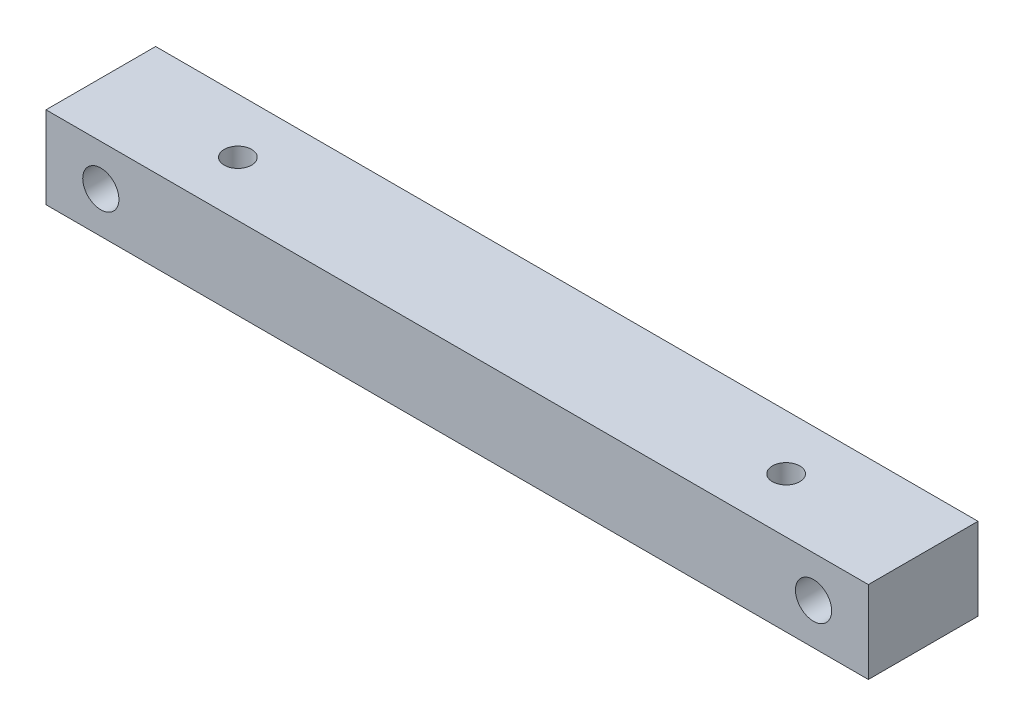
ISO-10303-21;
HEADER;
FILE_DESCRIPTION(('STEP AP214'),'2;1');
FILE_NAME('part.step','',(''),(''),'','','');
FILE_SCHEMA(('AUTOMOTIVE_DESIGN { 1 0 10303 214 1 1 1 1 }'));
ENDSEC;
DATA;
#1=APPLICATION_CONTEXT('core data for automotive mechanical design processes');
#2=APPLICATION_PROTOCOL_DEFINITION('international standard','automotive_design',2000,#1);
#3=PRODUCT_CONTEXT('',#1,'mechanical');
#4=PRODUCT('Part','Part','',(#3));
#5=PRODUCT_RELATED_PRODUCT_CATEGORY('part','',(#4));
#6=PRODUCT_DEFINITION_FORMATION('','',#4);
#7=PRODUCT_DEFINITION_CONTEXT('part definition',#1,'design');
#8=PRODUCT_DEFINITION('design','',#6,#7);
#9=PRODUCT_DEFINITION_SHAPE('','',#8);
#10=(LENGTH_UNIT() NAMED_UNIT(*) SI_UNIT(.MILLI.,.METRE.));
#11=(NAMED_UNIT(*) PLANE_ANGLE_UNIT() SI_UNIT($,.RADIAN.));
#12=(NAMED_UNIT(*) SI_UNIT($,.STERADIAN.) SOLID_ANGLE_UNIT());
#13=UNCERTAINTY_MEASURE_WITH_UNIT(LENGTH_MEASURE(1.E-05),#10,'distance_accuracy_value','');
#14=(GEOMETRIC_REPRESENTATION_CONTEXT(3) GLOBAL_UNCERTAINTY_ASSIGNED_CONTEXT((#13)) GLOBAL_UNIT_ASSIGNED_CONTEXT((#10,
#11,#12)) REPRESENTATION_CONTEXT('',''));
#15=CARTESIAN_POINT('',(0.,0.,0.));
#16=DIRECTION('',(0.,0.,1.));
#17=DIRECTION('',(1.,0.,0.));
#18=AXIS2_PLACEMENT_3D('',#15,#16,#17);
#19=CARTESIAN_POINT('',(-75.,7.49999999999999,20.));
#20=DIRECTION('',(1.,0.,0.));
#21=DIRECTION('',(0.,0.,-1.));
#22=AXIS2_PLACEMENT_3D('',#19,#20,#21);
#23=PLANE('',#22);
#24=DIRECTION('',(0.,-1.,0.));
#25=VECTOR('',#24,1.);
#26=CARTESIAN_POINT('',(-75.,7.49999999999999,0.));
#27=LINE('',#26,#25);
#28=CARTESIAN_POINT('',(-75.,7.49999999999999,0.));
#29=VERTEX_POINT('',#28);
#30=CARTESIAN_POINT('',(-75.,-7.50000000000001,0.));
#31=VERTEX_POINT('',#30);
#32=EDGE_CURVE('E97',#29,#31,#27,.T.);
#33=ORIENTED_EDGE('',*,*,#32,.T.);
#34=DIRECTION('',(0.,0.,-1.));
#35=VECTOR('',#34,1.);
#36=CARTESIAN_POINT('',(-75.,-7.50000000000001,20.));
#37=LINE('',#36,#35);
#38=CARTESIAN_POINT('',(-75.,-7.50000000000001,20.));
#39=VERTEX_POINT('',#38);
#40=EDGE_CURVE('E11',#39,#31,#37,.T.);
#41=ORIENTED_EDGE('',*,*,#40,.F.);
#42=DIRECTION('',(0.,-1.,0.));
#43=VECTOR('',#42,1.);
#44=CARTESIAN_POINT('',(-75.,7.49999999999999,20.));
#45=LINE('',#44,#43);
#46=CARTESIAN_POINT('',(-75.,7.49999999999999,20.));
#47=VERTEX_POINT('',#46);
#48=EDGE_CURVE('E85',#47,#39,#45,.T.);
#49=ORIENTED_EDGE('',*,*,#48,.F.);
#50=DIRECTION('',(0.,0.,-1.));
#51=VECTOR('',#50,1.);
#52=CARTESIAN_POINT('',(-75.,7.49999999999999,20.));
#53=LINE('',#52,#51);
#54=EDGE_CURVE('E93',#47,#29,#53,.T.);
#55=ORIENTED_EDGE('',*,*,#54,.T.);
#56=EDGE_LOOP('',(#33,#41,#49,#55));
#57=FACE_BOUND('',#56,.T.);
#58=ADVANCED_FACE('F34',(#57),#23,.F.);
#59=CARTESIAN_POINT('',(-75.,-7.50000000000001,20.));
#60=DIRECTION('',(0.,1.,0.));
#61=DIRECTION('',(0.,0.,1.));
#62=AXIS2_PLACEMENT_3D('',#59,#60,#61);
#63=PLANE('',#62);
#64=CARTESIAN_POINT('',(-50.,-7.50000000000001,10.));
#65=DIRECTION('',(0.,1.,0.));
#66=DIRECTION('',(0.,0.,1.));
#67=AXIS2_PLACEMENT_3D('',#64,#65,#66);
#68=CIRCLE('',#67,2.5);
#69=CARTESIAN_POINT('',(-50.,-7.50000000000001,12.5));
#70=VERTEX_POINT('',#69);
#71=EDGE_CURVE('E119',#70,#70,#68,.T.);
#72=ORIENTED_EDGE('',*,*,#71,.T.);
#73=EDGE_LOOP('',(#72));
#74=FACE_BOUND('',#73,.T.);
#75=CARTESIAN_POINT('',(50.,-7.50000000000001,10.));
#76=DIRECTION('',(0.,1.,0.));
#77=DIRECTION('',(0.,0.,1.));
#78=AXIS2_PLACEMENT_3D('',#75,#76,#77);
#79=CIRCLE('',#78,2.5);
#80=CARTESIAN_POINT('',(50.,-7.50000000000001,12.5));
#81=VERTEX_POINT('',#80);
#82=EDGE_CURVE('E113',#81,#81,#79,.T.);
#83=ORIENTED_EDGE('',*,*,#82,.T.);
#84=EDGE_LOOP('',(#83));
#85=FACE_BOUND('',#84,.T.);
#86=DIRECTION('',(1.,0.,0.));
#87=VECTOR('',#86,1.);
#88=CARTESIAN_POINT('',(-75.,-7.50000000000001,0.));
#89=LINE('',#88,#87);
#90=CARTESIAN_POINT('',(75.,-7.50000000000001,0.));
#91=VERTEX_POINT('',#90);
#92=EDGE_CURVE('E89',#31,#91,#89,.T.);
#93=ORIENTED_EDGE('',*,*,#92,.T.);
#94=DIRECTION('',(0.,0.,-1.));
#95=VECTOR('',#94,1.);
#96=CARTESIAN_POINT('',(75.,-7.50000000000001,20.));
#97=LINE('',#96,#95);
#98=CARTESIAN_POINT('',(75.,-7.50000000000001,20.));
#99=VERTEX_POINT('',#98);
#100=EDGE_CURVE('E42',#99,#91,#97,.T.);
#101=ORIENTED_EDGE('',*,*,#100,.F.);
#102=DIRECTION('',(1.,0.,0.));
#103=VECTOR('',#102,1.);
#104=CARTESIAN_POINT('',(-75.,-7.50000000000001,20.));
#105=LINE('',#104,#103);
#106=EDGE_CURVE('E80',#39,#99,#105,.T.);
#107=ORIENTED_EDGE('',*,*,#106,.F.);
#108=ORIENTED_EDGE('',*,*,#40,.T.);
#109=EDGE_LOOP('',(#93,#101,#107,#108));
#110=FACE_BOUND('',#109,.T.);
#111=ADVANCED_FACE('F88',(#74,#85,#110),#63,.F.);
#112=CARTESIAN_POINT('',(75.,7.49999999999999,20.));
#113=DIRECTION('',(-1.,0.,0.));
#114=DIRECTION('',(0.,0.,1.));
#115=AXIS2_PLACEMENT_3D('',#112,#113,#114);
#116=PLANE('',#115);
#117=DIRECTION('',(0.,1.,0.));
#118=VECTOR('',#117,1.);
#119=CARTESIAN_POINT('',(75.,7.49999999999999,0.));
#120=LINE('',#119,#118);
#121=CARTESIAN_POINT('',(75.,7.49999999999999,0.));
#122=VERTEX_POINT('',#121);
#123=EDGE_CURVE('E67',#91,#122,#120,.T.);
#124=ORIENTED_EDGE('',*,*,#123,.T.);
#125=DIRECTION('',(0.,0.,-1.));
#126=VECTOR('',#125,1.);
#127=CARTESIAN_POINT('',(75.,7.49999999999999,20.));
#128=LINE('',#127,#126);
#129=CARTESIAN_POINT('',(75.,7.49999999999999,20.));
#130=VERTEX_POINT('',#129);
#131=EDGE_CURVE('E90',#130,#122,#128,.T.);
#132=ORIENTED_EDGE('',*,*,#131,.F.);
#133=DIRECTION('',(0.,1.,0.));
#134=VECTOR('',#133,1.);
#135=CARTESIAN_POINT('',(75.,7.49999999999999,20.));
#136=LINE('',#135,#134);
#137=EDGE_CURVE('E83',#99,#130,#136,.T.);
#138=ORIENTED_EDGE('',*,*,#137,.F.);
#139=ORIENTED_EDGE('',*,*,#100,.T.);
#140=EDGE_LOOP('',(#124,#132,#138,#139));
#141=FACE_BOUND('',#140,.T.);
#142=ADVANCED_FACE('F91',(#141),#116,.F.);
#143=CARTESIAN_POINT('',(-75.,7.49999999999999,20.));
#144=DIRECTION('',(0.,-1.,0.));
#145=DIRECTION('',(0.,0.,-1.));
#146=AXIS2_PLACEMENT_3D('',#143,#144,#145);
#147=PLANE('',#146);
#148=CARTESIAN_POINT('',(-50.,7.5,10.));
#149=DIRECTION('',(0.,1.,0.));
#150=DIRECTION('',(0.,0.,1.));
#151=AXIS2_PLACEMENT_3D('',#148,#149,#150);
#152=CIRCLE('',#151,2.49999999999999);
#153=CARTESIAN_POINT('',(-50.,7.5,12.5));
#154=VERTEX_POINT('',#153);
#155=EDGE_CURVE('E116',#154,#154,#152,.T.);
#156=ORIENTED_EDGE('',*,*,#155,.F.);
#157=EDGE_LOOP('',(#156));
#158=FACE_BOUND('',#157,.T.);
#159=CARTESIAN_POINT('',(50.,7.5,10.));
#160=DIRECTION('',(0.,1.,0.));
#161=DIRECTION('',(0.,0.,1.));
#162=AXIS2_PLACEMENT_3D('',#159,#160,#161);
#163=CIRCLE('',#162,2.49999999999999);
#164=CARTESIAN_POINT('',(50.,7.5,12.5));
#165=VERTEX_POINT('',#164);
#166=EDGE_CURVE('E100',#165,#165,#163,.T.);
#167=ORIENTED_EDGE('',*,*,#166,.F.);
#168=EDGE_LOOP('',(#167));
#169=FACE_BOUND('',#168,.T.);
#170=DIRECTION('',(-1.,0.,0.));
#171=VECTOR('',#170,1.);
#172=CARTESIAN_POINT('',(-75.,7.49999999999999,0.));
#173=LINE('',#172,#171);
#174=EDGE_CURVE('E73',#122,#29,#173,.T.);
#175=ORIENTED_EDGE('',*,*,#174,.T.);
#176=ORIENTED_EDGE('',*,*,#54,.F.);
#177=DIRECTION('',(-1.,0.,0.));
#178=VECTOR('',#177,1.);
#179=CARTESIAN_POINT('',(-75.,7.49999999999999,20.));
#180=LINE('',#179,#178);
#181=EDGE_CURVE('E50',#130,#47,#180,.T.);
#182=ORIENTED_EDGE('',*,*,#181,.F.);
#183=ORIENTED_EDGE('',*,*,#131,.T.);
#184=EDGE_LOOP('',(#175,#176,#182,#183));
#185=FACE_BOUND('',#184,.T.);
#186=ADVANCED_FACE('F105',(#158,#169,#185),#147,.F.);
#187=CARTESIAN_POINT('',(-75.,-7.50000000000001,20.));
#188=DIRECTION('',(0.,0.,1.));
#189=DIRECTION('',(1.,0.,0.));
#190=AXIS2_PLACEMENT_3D('',#187,#188,#189);
#191=PLANE('',#190);
#192=CARTESIAN_POINT('',(-65.,0.,20.));
#193=DIRECTION('',(0.,0.,-1.));
#194=DIRECTION('',(-1.,0.,0.));
#195=AXIS2_PLACEMENT_3D('',#192,#193,#194);
#196=CIRCLE('',#195,3.3);
#197=CARTESIAN_POINT('',(-68.3,0.,20.));
#198=VERTEX_POINT('',#197);
#199=EDGE_CURVE('E143',#198,#198,#196,.T.);
#200=ORIENTED_EDGE('',*,*,#199,.T.);
#201=EDGE_LOOP('',(#200));
#202=FACE_BOUND('',#201,.T.);
#203=CARTESIAN_POINT('',(65.,0.,20.));
#204=DIRECTION('',(0.,0.,-1.));
#205=DIRECTION('',(-1.,0.,0.));
#206=AXIS2_PLACEMENT_3D('',#203,#204,#205);
#207=CIRCLE('',#206,3.3);
#208=CARTESIAN_POINT('',(61.7,0.,20.));
#209=VERTEX_POINT('',#208);
#210=EDGE_CURVE('E131',#209,#209,#207,.T.);
#211=ORIENTED_EDGE('',*,*,#210,.T.);
#212=EDGE_LOOP('',(#211));
#213=FACE_BOUND('',#212,.T.);
#214=ORIENTED_EDGE('',*,*,#48,.T.);
#215=ORIENTED_EDGE('',*,*,#106,.T.);
#216=ORIENTED_EDGE('',*,*,#137,.T.);
#217=ORIENTED_EDGE('',*,*,#181,.T.);
#218=EDGE_LOOP('',(#214,#215,#216,#217));
#219=FACE_BOUND('',#218,.T.);
#220=ADVANCED_FACE('F81',(#202,#213,#219),#191,.T.);
#221=CARTESIAN_POINT('',(-75.,-7.50000000000001,0.));
#222=DIRECTION('',(0.,0.,1.));
#223=DIRECTION('',(1.,0.,0.));
#224=AXIS2_PLACEMENT_3D('',#221,#222,#223);
#225=PLANE('',#224);
#226=CARTESIAN_POINT('',(-65.,0.,0.));
#227=DIRECTION('',(0.,0.,-1.));
#228=DIRECTION('',(-1.,0.,0.));
#229=AXIS2_PLACEMENT_3D('',#226,#227,#228);
#230=CIRCLE('',#229,5.5);
#231=CARTESIAN_POINT('',(-70.5,0.,0.));
#232=VERTEX_POINT('',#231);
#233=EDGE_CURVE('E134',#232,#232,#230,.T.);
#234=ORIENTED_EDGE('',*,*,#233,.F.);
#235=EDGE_LOOP('',(#234));
#236=FACE_BOUND('',#235,.T.);
#237=CARTESIAN_POINT('',(65.,0.,0.));
#238=DIRECTION('',(0.,0.,-1.));
#239=DIRECTION('',(-1.,0.,0.));
#240=AXIS2_PLACEMENT_3D('',#237,#238,#239);
#241=CIRCLE('',#240,5.50000000000001);
#242=CARTESIAN_POINT('',(59.5,0.,0.));
#243=VERTEX_POINT('',#242);
#244=EDGE_CURVE('E122',#243,#243,#241,.T.);
#245=ORIENTED_EDGE('',*,*,#244,.F.);
#246=EDGE_LOOP('',(#245));
#247=FACE_BOUND('',#246,.T.);
#248=ORIENTED_EDGE('',*,*,#32,.F.);
#249=ORIENTED_EDGE('',*,*,#174,.F.);
#250=ORIENTED_EDGE('',*,*,#123,.F.);
#251=ORIENTED_EDGE('',*,*,#92,.F.);
#252=EDGE_LOOP('',(#248,#249,#250,#251));
#253=FACE_BOUND('',#252,.T.);
#254=ADVANCED_FACE('F108',(#236,#247,#253),#225,.F.);
#255=CARTESIAN_POINT('',(50.,7.49999999999999,10.));
#256=DIRECTION('',(0.,1.,0.));
#257=DIRECTION('',(0.,0.,1.));
#258=AXIS2_PLACEMENT_3D('',#255,#256,#257);
#259=CYLINDRICAL_SURFACE('',#258,2.49999999999999);
#260=ORIENTED_EDGE('',*,*,#82,.F.);
#261=EDGE_LOOP('',(#260));
#262=FACE_BOUND('',#261,.T.);
#263=ORIENTED_EDGE('',*,*,#166,.T.);
#264=EDGE_LOOP('',(#263));
#265=FACE_BOUND('',#264,.T.);
#266=ADVANCED_FACE('F170',(#262,#265),#259,.F.);
#267=CARTESIAN_POINT('',(-50.,7.49999999999999,10.));
#268=DIRECTION('',(0.,1.,0.));
#269=DIRECTION('',(0.,0.,1.));
#270=AXIS2_PLACEMENT_3D('',#267,#268,#269);
#271=CYLINDRICAL_SURFACE('',#270,2.49999999999999);
#272=ORIENTED_EDGE('',*,*,#71,.F.);
#273=EDGE_LOOP('',(#272));
#274=FACE_BOUND('',#273,.T.);
#275=ORIENTED_EDGE('',*,*,#155,.T.);
#276=EDGE_LOOP('',(#275));
#277=FACE_BOUND('',#276,.T.);
#278=ADVANCED_FACE('F177',(#274,#277),#271,.F.);
#279=CARTESIAN_POINT('',(65.,0.,0.));
#280=DIRECTION('',(0.,0.,-1.));
#281=DIRECTION('',(-1.,0.,0.));
#282=AXIS2_PLACEMENT_3D('',#279,#280,#281);
#283=CYLINDRICAL_SURFACE('',#282,5.50000000000001);
#284=CARTESIAN_POINT('',(65.,0.,6.));
#285=DIRECTION('',(0.,0.,-1.));
#286=DIRECTION('',(-1.,0.,0.));
#287=AXIS2_PLACEMENT_3D('',#284,#285,#286);
#288=CIRCLE('',#287,5.50000000000001);
#289=CARTESIAN_POINT('',(59.5,0.,6.));
#290=VERTEX_POINT('',#289);
#291=EDGE_CURVE('E125',#290,#290,#288,.T.);
#292=ORIENTED_EDGE('',*,*,#291,.F.);
#293=EDGE_LOOP('',(#292));
#294=FACE_BOUND('',#293,.T.);
#295=ORIENTED_EDGE('',*,*,#244,.T.);
#296=EDGE_LOOP('',(#295));
#297=FACE_BOUND('',#296,.T.);
#298=ADVANCED_FACE('F174',(#294,#297),#283,.F.);
#299=CARTESIAN_POINT('',(68.3,0.,6.));
#300=DIRECTION('',(0.,0.,1.));
#301=DIRECTION('',(1.,0.,0.));
#302=AXIS2_PLACEMENT_3D('',#299,#300,#301);
#303=PLANE('',#302);
#304=CARTESIAN_POINT('',(65.,0.,6.));
#305=DIRECTION('',(0.,0.,-1.));
#306=DIRECTION('',(-1.,0.,0.));
#307=AXIS2_PLACEMENT_3D('',#304,#305,#306);
#308=CIRCLE('',#307,3.3);
#309=CARTESIAN_POINT('',(61.7,0.,6.));
#310=VERTEX_POINT('',#309);
#311=EDGE_CURVE('E128',#310,#310,#308,.T.);
#312=ORIENTED_EDGE('',*,*,#311,.F.);
#313=EDGE_LOOP('',(#312));
#314=FACE_BOUND('',#313,.T.);
#315=ORIENTED_EDGE('',*,*,#291,.T.);
#316=EDGE_LOOP('',(#315));
#317=FACE_BOUND('',#316,.T.);
#318=ADVANCED_FACE('F176',(#314,#317),#303,.F.);
#319=CARTESIAN_POINT('',(65.,0.,0.));
#320=DIRECTION('',(0.,0.,-1.));
#321=DIRECTION('',(-1.,0.,0.));
#322=AXIS2_PLACEMENT_3D('',#319,#320,#321);
#323=CYLINDRICAL_SURFACE('',#322,3.3);
#324=ORIENTED_EDGE('',*,*,#210,.F.);
#325=EDGE_LOOP('',(#324));
#326=FACE_BOUND('',#325,.T.);
#327=ORIENTED_EDGE('',*,*,#311,.T.);
#328=EDGE_LOOP('',(#327));
#329=FACE_BOUND('',#328,.T.);
#330=ADVANCED_FACE('F164',(#326,#329),#323,.F.);
#331=CARTESIAN_POINT('',(-65.,0.,0.));
#332=DIRECTION('',(0.,0.,-1.));
#333=DIRECTION('',(-1.,0.,0.));
#334=AXIS2_PLACEMENT_3D('',#331,#332,#333);
#335=CYLINDRICAL_SURFACE('',#334,5.5);
#336=CARTESIAN_POINT('',(-65.,0.,6.));
#337=DIRECTION('',(0.,0.,-1.));
#338=DIRECTION('',(-1.,0.,0.));
#339=AXIS2_PLACEMENT_3D('',#336,#337,#338);
#340=CIRCLE('',#339,5.5);
#341=CARTESIAN_POINT('',(-70.5,0.,6.));
#342=VERTEX_POINT('',#341);
#343=EDGE_CURVE('E137',#342,#342,#340,.T.);
#344=ORIENTED_EDGE('',*,*,#343,.F.);
#345=EDGE_LOOP('',(#344));
#346=FACE_BOUND('',#345,.T.);
#347=ORIENTED_EDGE('',*,*,#233,.T.);
#348=EDGE_LOOP('',(#347));
#349=FACE_BOUND('',#348,.T.);
#350=ADVANCED_FACE('F158',(#346,#349),#335,.F.);
#351=CARTESIAN_POINT('',(-61.7,0.,6.));
#352=DIRECTION('',(0.,0.,1.));
#353=DIRECTION('',(1.,0.,0.));
#354=AXIS2_PLACEMENT_3D('',#351,#352,#353);
#355=PLANE('',#354);
#356=CARTESIAN_POINT('',(-65.,0.,6.));
#357=DIRECTION('',(0.,0.,-1.));
#358=DIRECTION('',(-1.,0.,0.));
#359=AXIS2_PLACEMENT_3D('',#356,#357,#358);
#360=CIRCLE('',#359,3.3);
#361=CARTESIAN_POINT('',(-68.3,0.,6.));
#362=VERTEX_POINT('',#361);
#363=EDGE_CURVE('E140',#362,#362,#360,.T.);
#364=ORIENTED_EDGE('',*,*,#363,.F.);
#365=EDGE_LOOP('',(#364));
#366=FACE_BOUND('',#365,.T.);
#367=ORIENTED_EDGE('',*,*,#343,.T.);
#368=EDGE_LOOP('',(#367));
#369=FACE_BOUND('',#368,.T.);
#370=ADVANCED_FACE('F152',(#366,#369),#355,.F.);
#371=CARTESIAN_POINT('',(-65.,0.,0.));
#372=DIRECTION('',(0.,0.,-1.));
#373=DIRECTION('',(-1.,0.,0.));
#374=AXIS2_PLACEMENT_3D('',#371,#372,#373);
#375=CYLINDRICAL_SURFACE('',#374,3.3);
#376=ORIENTED_EDGE('',*,*,#199,.F.);
#377=EDGE_LOOP('',(#376));
#378=FACE_BOUND('',#377,.T.);
#379=ORIENTED_EDGE('',*,*,#363,.T.);
#380=EDGE_LOOP('',(#379));
#381=FACE_BOUND('',#380,.T.);
#382=ADVANCED_FACE('F149',(#378,#381),#375,.F.);
#383=CLOSED_SHELL('',(#58,#111,#142,#186,#220,#254,#266,#278,#298,#318,#330,#350,#370,#382));
#384=MANIFOLD_SOLID_BREP('B2',#383);
#385=ADVANCED_BREP_SHAPE_REPRESENTATION('',(#18,#384),#14);
#386=SHAPE_DEFINITION_REPRESENTATION(#9,#385);
ENDSEC;
END-ISO-10303-21;
